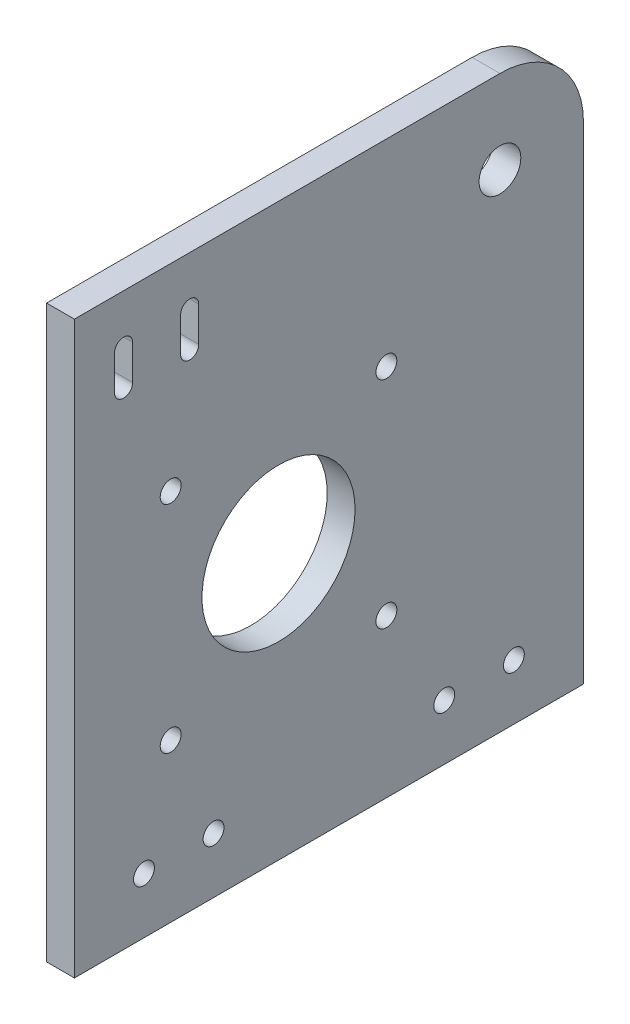
ISO-10303-21;
HEADER;
FILE_DESCRIPTION(('STEP AP214'),'2;1');
FILE_NAME('part.step','',(''),(''),'','','');
FILE_SCHEMA(('AUTOMOTIVE_DESIGN { 1 0 10303 214 1 1 1 1 }'));
ENDSEC;
DATA;
#1=APPLICATION_CONTEXT('core data for automotive mechanical design processes');
#2=APPLICATION_PROTOCOL_DEFINITION('international standard','automotive_design',2000,#1);
#3=PRODUCT_CONTEXT('',#1,'mechanical');
#4=PRODUCT('Part','Part','',(#3));
#5=PRODUCT_RELATED_PRODUCT_CATEGORY('part','',(#4));
#6=PRODUCT_DEFINITION_FORMATION('','',#4);
#7=PRODUCT_DEFINITION_CONTEXT('part definition',#1,'design');
#8=PRODUCT_DEFINITION('design','',#6,#7);
#9=PRODUCT_DEFINITION_SHAPE('','',#8);
#10=(LENGTH_UNIT() NAMED_UNIT(*) SI_UNIT(.MILLI.,.METRE.));
#11=(NAMED_UNIT(*) PLANE_ANGLE_UNIT() SI_UNIT($,.RADIAN.));
#12=(NAMED_UNIT(*) SI_UNIT($,.STERADIAN.) SOLID_ANGLE_UNIT());
#13=UNCERTAINTY_MEASURE_WITH_UNIT(LENGTH_MEASURE(1.E-05),#10,'distance_accuracy_value','');
#14=(GEOMETRIC_REPRESENTATION_CONTEXT(3) GLOBAL_UNCERTAINTY_ASSIGNED_CONTEXT((#13)) GLOBAL_UNIT_ASSIGNED_CONTEXT((#10,
#11,#12)) REPRESENTATION_CONTEXT('',''));
#15=CARTESIAN_POINT('',(0.,0.,0.));
#16=DIRECTION('',(0.,0.,1.));
#17=DIRECTION('',(1.,0.,0.));
#18=AXIS2_PLACEMENT_3D('',#15,#16,#17);
#19=CARTESIAN_POINT('',(4.,0.,0.));
#20=DIRECTION('',(-1.,0.,0.));
#21=DIRECTION('',(0.,0.,1.));
#22=AXIS2_PLACEMENT_3D('',#19,#20,#21);
#23=CYLINDRICAL_SURFACE('',#22,12.);
#24=CARTESIAN_POINT('',(0.,0.,0.));
#25=DIRECTION('',(1.,0.,0.));
#26=DIRECTION('',(0.,0.,-1.));
#27=AXIS2_PLACEMENT_3D('',#24,#25,#26);
#28=CIRCLE('',#27,12.);
#29=CARTESIAN_POINT('',(0.,12.,0.));
#30=VERTEX_POINT('',#29);
#31=CARTESIAN_POINT('',(0.,0.,-12.));
#32=VERTEX_POINT('',#31);
#33=EDGE_CURVE('E250',#30,#32,#28,.F.);
#34=ORIENTED_EDGE('',*,*,#33,.F.);
#35=DIRECTION('',(-1.,0.,0.));
#36=VECTOR('',#35,1.);
#37=CARTESIAN_POINT('',(4.,12.,0.));
#38=LINE('',#37,#36);
#39=CARTESIAN_POINT('',(4.,12.,0.));
#40=VERTEX_POINT('',#39);
#41=EDGE_CURVE('E277',#40,#30,#38,.T.);
#42=ORIENTED_EDGE('',*,*,#41,.F.);
#43=CARTESIAN_POINT('',(4.,0.,0.));
#44=DIRECTION('',(1.,0.,0.));
#45=DIRECTION('',(0.,0.,-1.));
#46=AXIS2_PLACEMENT_3D('',#43,#44,#45);
#47=CIRCLE('',#46,12.);
#48=CARTESIAN_POINT('',(4.,0.,-12.));
#49=VERTEX_POINT('',#48);
#50=EDGE_CURVE('E206',#40,#49,#47,.F.);
#51=ORIENTED_EDGE('',*,*,#50,.T.);
#52=DIRECTION('',(-1.,0.,0.));
#53=VECTOR('',#52,1.);
#54=CARTESIAN_POINT('',(4.,0.,-12.));
#55=LINE('',#54,#53);
#56=EDGE_CURVE('E226',#49,#32,#55,.T.);
#57=ORIENTED_EDGE('',*,*,#56,.T.);
#58=EDGE_LOOP('',(#34,#42,#51,#57));
#59=FACE_BOUND('',#58,.T.);
#60=ADVANCED_FACE('F37',(#59),#23,.T.);
#61=CARTESIAN_POINT('',(4.,12.,0.));
#62=DIRECTION('',(0.,1.,0.));
#63=DIRECTION('',(0.,0.,1.));
#64=AXIS2_PLACEMENT_3D('',#61,#62,#63);
#65=PLANE('',#64);
#66=DIRECTION('',(0.,0.,-1.));
#67=VECTOR('',#66,1.);
#68=CARTESIAN_POINT('',(0.,12.,0.));
#69=LINE('',#68,#67);
#70=CARTESIAN_POINT('',(0.,12.,61.1551336484807));
#71=VERTEX_POINT('',#70);
#72=EDGE_CURVE('E253',#71,#30,#69,.T.);
#73=ORIENTED_EDGE('',*,*,#72,.F.);
#74=DIRECTION('',(-1.,0.,0.));
#75=VECTOR('',#74,1.);
#76=CARTESIAN_POINT('',(4.,12.,61.1551336484807));
#77=LINE('',#76,#75);
#78=CARTESIAN_POINT('',(4.,12.,61.1551336484807));
#79=VERTEX_POINT('',#78);
#80=EDGE_CURVE('E275',#79,#71,#77,.T.);
#81=ORIENTED_EDGE('',*,*,#80,.F.);
#82=DIRECTION('',(0.,0.,-1.));
#83=VECTOR('',#82,1.);
#84=CARTESIAN_POINT('',(4.,12.,0.));
#85=LINE('',#84,#83);
#86=EDGE_CURVE('E209',#79,#40,#85,.T.);
#87=ORIENTED_EDGE('',*,*,#86,.T.);
#88=ORIENTED_EDGE('',*,*,#41,.T.);
#89=EDGE_LOOP('',(#73,#81,#87,#88));
#90=FACE_BOUND('',#89,.T.);
#91=ADVANCED_FACE('F314',(#90),#65,.T.);
#92=CARTESIAN_POINT('',(4.,0.,61.1551336484807));
#93=DIRECTION('',(0.,0.,1.));
#94=DIRECTION('',(1.,0.,0.));
#95=AXIS2_PLACEMENT_3D('',#92,#93,#94);
#96=PLANE('',#95);
#97=DIRECTION('',(0.,1.,0.));
#98=VECTOR('',#97,1.);
#99=CARTESIAN_POINT('',(0.,0.,61.1551336484807));
#100=LINE('',#99,#98);
#101=CARTESIAN_POINT('',(0.,-70.,61.1551336484807));
#102=VERTEX_POINT('',#101);
#103=EDGE_CURVE('E256',#102,#71,#100,.T.);
#104=ORIENTED_EDGE('',*,*,#103,.F.);
#105=DIRECTION('',(-1.,0.,0.));
#106=VECTOR('',#105,1.);
#107=CARTESIAN_POINT('',(4.,-70.,61.1551336484807));
#108=LINE('',#107,#106);
#109=CARTESIAN_POINT('',(4.,-70.,61.1551336484807));
#110=VERTEX_POINT('',#109);
#111=EDGE_CURVE('E273',#110,#102,#108,.T.);
#112=ORIENTED_EDGE('',*,*,#111,.F.);
#113=DIRECTION('',(0.,1.,0.));
#114=VECTOR('',#113,1.);
#115=CARTESIAN_POINT('',(4.,0.,61.1551336484807));
#116=LINE('',#115,#114);
#117=EDGE_CURVE('E212',#110,#79,#116,.T.);
#118=ORIENTED_EDGE('',*,*,#117,.T.);
#119=ORIENTED_EDGE('',*,*,#80,.T.);
#120=EDGE_LOOP('',(#104,#112,#118,#119));
#121=FACE_BOUND('',#120,.T.);
#122=ADVANCED_FACE('F320',(#121),#96,.T.);
#123=CARTESIAN_POINT('',(4.,-70.,0.));
#124=DIRECTION('',(0.,1.,0.));
#125=DIRECTION('',(0.,0.,1.));
#126=AXIS2_PLACEMENT_3D('',#123,#124,#125);
#127=PLANE('',#126);
#128=DIRECTION('',(0.,0.,-1.));
#129=VECTOR('',#128,1.);
#130=CARTESIAN_POINT('',(0.,-70.,0.));
#131=LINE('',#130,#129);
#132=CARTESIAN_POINT('',(0.,-70.,-12.));
#133=VERTEX_POINT('',#132);
#134=EDGE_CURVE('E259',#102,#133,#131,.T.);
#135=ORIENTED_EDGE('',*,*,#134,.T.);
#136=DIRECTION('',(-1.,0.,0.));
#137=VECTOR('',#136,1.);
#138=CARTESIAN_POINT('',(4.,-70.,-12.));
#139=LINE('',#138,#137);
#140=CARTESIAN_POINT('',(4.,-70.,-12.));
#141=VERTEX_POINT('',#140);
#142=EDGE_CURVE('E271',#141,#133,#139,.T.);
#143=ORIENTED_EDGE('',*,*,#142,.F.);
#144=DIRECTION('',(0.,0.,-1.));
#145=VECTOR('',#144,1.);
#146=CARTESIAN_POINT('',(4.,-70.,0.));
#147=LINE('',#146,#145);
#148=EDGE_CURVE('E215',#110,#141,#147,.T.);
#149=ORIENTED_EDGE('',*,*,#148,.F.);
#150=ORIENTED_EDGE('',*,*,#111,.T.);
#151=EDGE_LOOP('',(#135,#143,#149,#150));
#152=FACE_BOUND('',#151,.T.);
#153=ADVANCED_FACE('F396',(#152),#127,.F.);
#154=CARTESIAN_POINT('',(4.,-62.,51.1551336484807));
#155=DIRECTION('',(-1.,0.,0.));
#156=DIRECTION('',(0.,0.,1.));
#157=AXIS2_PLACEMENT_3D('',#154,#155,#156);
#158=CYLINDRICAL_SURFACE('',#157,1.5);
#159=CARTESIAN_POINT('',(4.,-62.,51.1551336484807));
#160=DIRECTION('',(1.,0.,0.));
#161=DIRECTION('',(0.,0.,-1.));
#162=AXIS2_PLACEMENT_3D('',#159,#160,#161);
#163=CIRCLE('',#162,1.5);
#164=CARTESIAN_POINT('',(4.,-62.,49.6551336484807));
#165=VERTEX_POINT('',#164);
#166=EDGE_CURVE('E220',#165,#165,#163,.T.);
#167=ORIENTED_EDGE('',*,*,#166,.T.);
#168=EDGE_LOOP('',(#167));
#169=FACE_BOUND('',#168,.T.);
#170=CARTESIAN_POINT('',(0.,-62.,51.1551336484807));
#171=DIRECTION('',(1.,0.,0.));
#172=DIRECTION('',(0.,0.,-1.));
#173=AXIS2_PLACEMENT_3D('',#170,#171,#172);
#174=CIRCLE('',#173,1.5);
#175=CARTESIAN_POINT('',(0.,-62.,49.6551336484807));
#176=VERTEX_POINT('',#175);
#177=EDGE_CURVE('E265',#176,#176,#174,.T.);
#178=ORIENTED_EDGE('',*,*,#177,.F.);
#179=EDGE_LOOP('',(#178));
#180=FACE_BOUND('',#179,.T.);
#181=ADVANCED_FACE('F393',(#169,#180),#158,.F.);
#182=CARTESIAN_POINT('',(4.,0.,-12.));
#183=DIRECTION('',(0.,0.,-1.));
#184=DIRECTION('',(0.,1.,0.));
#185=AXIS2_PLACEMENT_3D('',#182,#183,#184);
#186=PLANE('',#185);
#187=DIRECTION('',(0.,-1.,0.));
#188=VECTOR('',#187,1.);
#189=CARTESIAN_POINT('',(0.,0.,-12.));
#190=LINE('',#189,#188);
#191=EDGE_CURVE('E262',#32,#133,#190,.T.);
#192=ORIENTED_EDGE('',*,*,#191,.F.);
#193=ORIENTED_EDGE('',*,*,#56,.F.);
#194=DIRECTION('',(0.,-1.,0.));
#195=VECTOR('',#194,1.);
#196=CARTESIAN_POINT('',(4.,0.,-12.));
#197=LINE('',#196,#195);
#198=EDGE_CURVE('E217',#49,#141,#197,.T.);
#199=ORIENTED_EDGE('',*,*,#198,.T.);
#200=ORIENTED_EDGE('',*,*,#142,.T.);
#201=EDGE_LOOP('',(#192,#193,#199,#200));
#202=FACE_BOUND('',#201,.T.);
#203=ADVANCED_FACE('F330',(#202),#186,.T.);
#204=CARTESIAN_POINT('',(4.,-31.8198051533946,31.8198051533946));
#205=DIRECTION('',(-1.,0.,0.));
#206=DIRECTION('',(0.,0.,1.));
#207=AXIS2_PLACEMENT_3D('',#204,#205,#206);
#208=CYLINDRICAL_SURFACE('',#207,11.);
#209=CARTESIAN_POINT('',(4.,-31.8198051533946,31.8198051533946));
#210=DIRECTION('',(1.,0.,0.));
#211=DIRECTION('',(0.,0.,-1.));
#212=AXIS2_PLACEMENT_3D('',#209,#210,#211);
#213=CIRCLE('',#212,11.);
#214=CARTESIAN_POINT('',(4.,-31.8198051533946,20.8198051533946));
#215=VERTEX_POINT('',#214);
#216=EDGE_CURVE('E203',#215,#215,#213,.T.);
#217=ORIENTED_EDGE('',*,*,#216,.T.);
#218=EDGE_LOOP('',(#217));
#219=FACE_BOUND('',#218,.T.);
#220=CARTESIAN_POINT('',(0.,-31.8198051533946,31.8198051533946));
#221=DIRECTION('',(1.,0.,0.));
#222=DIRECTION('',(0.,0.,-1.));
#223=AXIS2_PLACEMENT_3D('',#220,#221,#222);
#224=CIRCLE('',#223,11.);
#225=CARTESIAN_POINT('',(0.,-31.8198051533946,20.8198051533946));
#226=VERTEX_POINT('',#225);
#227=EDGE_CURVE('E247',#226,#226,#224,.T.);
#228=ORIENTED_EDGE('',*,*,#227,.F.);
#229=EDGE_LOOP('',(#228));
#230=FACE_BOUND('',#229,.T.);
#231=ADVANCED_FACE('F326',(#219,#230),#208,.F.);
#232=CARTESIAN_POINT('',(4.,-62.,41.1551336484807));
#233=DIRECTION('',(-1.,0.,0.));
#234=DIRECTION('',(0.,0.,1.));
#235=AXIS2_PLACEMENT_3D('',#232,#233,#234);
#236=CYLINDRICAL_SURFACE('',#235,1.5);
#237=CARTESIAN_POINT('',(4.,-62.,41.1551336484807));
#238=DIRECTION('',(1.,0.,0.));
#239=DIRECTION('',(0.,0.,-1.));
#240=AXIS2_PLACEMENT_3D('',#237,#238,#239);
#241=CIRCLE('',#240,1.5);
#242=CARTESIAN_POINT('',(4.,-62.,39.6551336484807));
#243=VERTEX_POINT('',#242);
#244=EDGE_CURVE('E200',#243,#243,#241,.T.);
#245=ORIENTED_EDGE('',*,*,#244,.T.);
#246=EDGE_LOOP('',(#245));
#247=FACE_BOUND('',#246,.T.);
#248=CARTESIAN_POINT('',(0.,-62.,41.1551336484807));
#249=DIRECTION('',(1.,0.,0.));
#250=DIRECTION('',(0.,0.,-1.));
#251=AXIS2_PLACEMENT_3D('',#248,#249,#250);
#252=CIRCLE('',#251,1.5);
#253=CARTESIAN_POINT('',(0.,-62.,39.6551336484807));
#254=VERTEX_POINT('',#253);
#255=EDGE_CURVE('E244',#254,#254,#252,.T.);
#256=ORIENTED_EDGE('',*,*,#255,.F.);
#257=EDGE_LOOP('',(#256));
#258=FACE_BOUND('',#257,.T.);
#259=ADVANCED_FACE('F329',(#247,#258),#236,.F.);
#260=CARTESIAN_POINT('',(4.,-62.,7.99999999999999));
#261=DIRECTION('',(-1.,0.,0.));
#262=DIRECTION('',(0.,0.,1.));
#263=AXIS2_PLACEMENT_3D('',#260,#261,#262);
#264=CYLINDRICAL_SURFACE('',#263,1.5);
#265=CARTESIAN_POINT('',(4.,-62.,7.99999999999999));
#266=DIRECTION('',(1.,0.,0.));
#267=DIRECTION('',(0.,0.,-1.));
#268=AXIS2_PLACEMENT_3D('',#265,#266,#267);
#269=CIRCLE('',#268,1.5);
#270=CARTESIAN_POINT('',(4.,-62.,6.49999999999999));
#271=VERTEX_POINT('',#270);
#272=EDGE_CURVE('E197',#271,#271,#269,.T.);
#273=ORIENTED_EDGE('',*,*,#272,.T.);
#274=EDGE_LOOP('',(#273));
#275=FACE_BOUND('',#274,.T.);
#276=CARTESIAN_POINT('',(0.,-62.,7.99999999999999));
#277=DIRECTION('',(1.,0.,0.));
#278=DIRECTION('',(0.,0.,-1.));
#279=AXIS2_PLACEMENT_3D('',#276,#277,#278);
#280=CIRCLE('',#279,1.5);
#281=CARTESIAN_POINT('',(0.,-62.,6.49999999999999));
#282=VERTEX_POINT('',#281);
#283=EDGE_CURVE('E241',#282,#282,#280,.T.);
#284=ORIENTED_EDGE('',*,*,#283,.F.);
#285=EDGE_LOOP('',(#284));
#286=FACE_BOUND('',#285,.T.);
#287=ADVANCED_FACE('F334',(#275,#286),#264,.F.);
#288=CARTESIAN_POINT('',(4.,-62.,-2.00000000000001));
#289=DIRECTION('',(-1.,0.,0.));
#290=DIRECTION('',(0.,0.,1.));
#291=AXIS2_PLACEMENT_3D('',#288,#289,#290);
#292=CYLINDRICAL_SURFACE('',#291,1.5);
#293=CARTESIAN_POINT('',(4.,-62.,-2.00000000000001));
#294=DIRECTION('',(1.,0.,0.));
#295=DIRECTION('',(0.,0.,-1.));
#296=AXIS2_PLACEMENT_3D('',#293,#294,#295);
#297=CIRCLE('',#296,1.5);
#298=CARTESIAN_POINT('',(4.,-62.,-3.50000000000001));
#299=VERTEX_POINT('',#298);
#300=EDGE_CURVE('E194',#299,#299,#297,.T.);
#301=ORIENTED_EDGE('',*,*,#300,.T.);
#302=EDGE_LOOP('',(#301));
#303=FACE_BOUND('',#302,.T.);
#304=CARTESIAN_POINT('',(0.,-62.,-2.00000000000001));
#305=DIRECTION('',(1.,0.,0.));
#306=DIRECTION('',(0.,0.,-1.));
#307=AXIS2_PLACEMENT_3D('',#304,#305,#306);
#308=CIRCLE('',#307,1.5);
#309=CARTESIAN_POINT('',(0.,-62.,-3.50000000000001));
#310=VERTEX_POINT('',#309);
#311=EDGE_CURVE('E238',#310,#310,#308,.T.);
#312=ORIENTED_EDGE('',*,*,#311,.F.);
#313=EDGE_LOOP('',(#312));
#314=FACE_BOUND('',#313,.T.);
#315=ADVANCED_FACE('F338',(#303,#314),#292,.F.);
#316=CARTESIAN_POINT('',(4.,-16.3198051533946,16.3198051533946));
#317=DIRECTION('',(-1.,0.,0.));
#318=DIRECTION('',(0.,0.,1.));
#319=AXIS2_PLACEMENT_3D('',#316,#317,#318);
#320=CYLINDRICAL_SURFACE('',#319,1.5);
#321=CARTESIAN_POINT('',(4.,-16.3198051533946,16.3198051533946));
#322=DIRECTION('',(1.,0.,0.));
#323=DIRECTION('',(0.,0.,-1.));
#324=AXIS2_PLACEMENT_3D('',#321,#322,#323);
#325=CIRCLE('',#324,1.5);
#326=CARTESIAN_POINT('',(4.,-16.3198051533946,14.8198051533946));
#327=VERTEX_POINT('',#326);
#328=EDGE_CURVE('E191',#327,#327,#325,.T.);
#329=ORIENTED_EDGE('',*,*,#328,.T.);
#330=EDGE_LOOP('',(#329));
#331=FACE_BOUND('',#330,.T.);
#332=CARTESIAN_POINT('',(0.,-16.3198051533946,16.3198051533946));
#333=DIRECTION('',(1.,0.,0.));
#334=DIRECTION('',(0.,0.,-1.));
#335=AXIS2_PLACEMENT_3D('',#332,#333,#334);
#336=CIRCLE('',#335,1.5);
#337=CARTESIAN_POINT('',(0.,-16.3198051533946,14.8198051533946));
#338=VERTEX_POINT('',#337);
#339=EDGE_CURVE('E235',#338,#338,#336,.T.);
#340=ORIENTED_EDGE('',*,*,#339,.F.);
#341=EDGE_LOOP('',(#340));
#342=FACE_BOUND('',#341,.T.);
#343=ADVANCED_FACE('F342',(#331,#342),#320,.F.);
#344=CARTESIAN_POINT('',(4.,-47.3198051466054,16.3198051533938));
#345=DIRECTION('',(-1.,0.,0.));
#346=DIRECTION('',(0.,0.,1.));
#347=AXIS2_PLACEMENT_3D('',#344,#345,#346);
#348=CYLINDRICAL_SURFACE('',#347,1.5);
#349=CARTESIAN_POINT('',(4.,-47.3198051466054,16.3198051533938));
#350=DIRECTION('',(1.,0.,0.));
#351=DIRECTION('',(0.,0.,-1.));
#352=AXIS2_PLACEMENT_3D('',#349,#350,#351);
#353=CIRCLE('',#352,1.5);
#354=CARTESIAN_POINT('',(4.,-47.3198051466054,14.8198051533938));
#355=VERTEX_POINT('',#354);
#356=EDGE_CURVE('E188',#355,#355,#353,.T.);
#357=ORIENTED_EDGE('',*,*,#356,.T.);
#358=EDGE_LOOP('',(#357));
#359=FACE_BOUND('',#358,.T.);
#360=CARTESIAN_POINT('',(0.,-47.3198051466054,16.3198051533938));
#361=DIRECTION('',(1.,0.,0.));
#362=DIRECTION('',(0.,0.,-1.));
#363=AXIS2_PLACEMENT_3D('',#360,#361,#362);
#364=CIRCLE('',#363,1.5);
#365=CARTESIAN_POINT('',(0.,-47.3198051466054,14.8198051533938));
#366=VERTEX_POINT('',#365);
#367=EDGE_CURVE('E232',#366,#366,#364,.T.);
#368=ORIENTED_EDGE('',*,*,#367,.F.);
#369=EDGE_LOOP('',(#368));
#370=FACE_BOUND('',#369,.T.);
#371=ADVANCED_FACE('F346',(#359,#370),#348,.F.);
#372=CARTESIAN_POINT('',(4.,-47.3198051466061,47.3198051466046));
#373=DIRECTION('',(-1.,0.,0.));
#374=DIRECTION('',(0.,0.,1.));
#375=AXIS2_PLACEMENT_3D('',#372,#373,#374);
#376=CYLINDRICAL_SURFACE('',#375,1.5);
#377=CARTESIAN_POINT('',(4.,-47.3198051466061,47.3198051466046));
#378=DIRECTION('',(1.,0.,0.));
#379=DIRECTION('',(0.,0.,-1.));
#380=AXIS2_PLACEMENT_3D('',#377,#378,#379);
#381=CIRCLE('',#380,1.5);
#382=CARTESIAN_POINT('',(4.,-47.3198051466061,45.8198051466046));
#383=VERTEX_POINT('',#382);
#384=EDGE_CURVE('E184',#383,#383,#381,.T.);
#385=ORIENTED_EDGE('',*,*,#384,.T.);
#386=EDGE_LOOP('',(#385));
#387=FACE_BOUND('',#386,.T.);
#388=CARTESIAN_POINT('',(0.,-47.3198051466061,47.3198051466046));
#389=DIRECTION('',(1.,0.,0.));
#390=DIRECTION('',(0.,0.,-1.));
#391=AXIS2_PLACEMENT_3D('',#388,#389,#390);
#392=CIRCLE('',#391,1.5);
#393=CARTESIAN_POINT('',(0.,-47.3198051466061,45.8198051466046));
#394=VERTEX_POINT('',#393);
#395=EDGE_CURVE('E229',#394,#394,#392,.T.);
#396=ORIENTED_EDGE('',*,*,#395,.F.);
#397=EDGE_LOOP('',(#396));
#398=FACE_BOUND('',#397,.T.);
#399=ADVANCED_FACE('F349',(#387,#398),#376,.F.);
#400=CARTESIAN_POINT('',(4.,-16.3198051533953,47.3198051466052));
#401=DIRECTION('',(-1.,0.,0.));
#402=DIRECTION('',(0.,0.,1.));
#403=AXIS2_PLACEMENT_3D('',#400,#401,#402);
#404=CYLINDRICAL_SURFACE('',#403,1.5);
#405=CARTESIAN_POINT('',(4.,-16.3198051533953,47.3198051466052));
#406=DIRECTION('',(1.,0.,0.));
#407=DIRECTION('',(0.,0.,-1.));
#408=AXIS2_PLACEMENT_3D('',#405,#406,#407);
#409=CIRCLE('',#408,1.5);
#410=CARTESIAN_POINT('',(4.,-16.3198051533953,45.8198051466052));
#411=VERTEX_POINT('',#410);
#412=EDGE_CURVE('E181',#411,#411,#409,.T.);
#413=ORIENTED_EDGE('',*,*,#412,.T.);
#414=EDGE_LOOP('',(#413));
#415=FACE_BOUND('',#414,.T.);
#416=CARTESIAN_POINT('',(0.,-16.3198051533953,47.3198051466052));
#417=DIRECTION('',(1.,0.,0.));
#418=DIRECTION('',(0.,0.,-1.));
#419=AXIS2_PLACEMENT_3D('',#416,#417,#418);
#420=CIRCLE('',#419,1.5);
#421=CARTESIAN_POINT('',(0.,-16.3198051533953,45.8198051466052));
#422=VERTEX_POINT('',#421);
#423=EDGE_CURVE('E174',#422,#422,#420,.T.);
#424=ORIENTED_EDGE('',*,*,#423,.F.);
#425=EDGE_LOOP('',(#424));
#426=FACE_BOUND('',#425,.T.);
#427=ADVANCED_FACE('F39',(#415,#426),#404,.F.);
#428=CARTESIAN_POINT('',(4.,0.,0.));
#429=DIRECTION('',(-1.,0.,0.));
#430=DIRECTION('',(0.,0.,1.));
#431=AXIS2_PLACEMENT_3D('',#428,#429,#430);
#432=CYLINDRICAL_SURFACE('',#431,3.);
#433=CARTESIAN_POINT('',(4.,0.,0.));
#434=DIRECTION('',(1.,0.,0.));
#435=DIRECTION('',(0.,0.,-1.));
#436=AXIS2_PLACEMENT_3D('',#433,#434,#435);
#437=CIRCLE('',#436,3.);
#438=CARTESIAN_POINT('',(4.,0.,-3.));
#439=VERTEX_POINT('',#438);
#440=EDGE_CURVE('E223',#439,#439,#437,.T.);
#441=ORIENTED_EDGE('',*,*,#440,.T.);
#442=EDGE_LOOP('',(#441));
#443=FACE_BOUND('',#442,.T.);
#444=CARTESIAN_POINT('',(0.,0.,0.));
#445=DIRECTION('',(1.,0.,0.));
#446=DIRECTION('',(0.,0.,-1.));
#447=AXIS2_PLACEMENT_3D('',#444,#445,#446);
#448=CIRCLE('',#447,3.);
#449=CARTESIAN_POINT('',(0.,0.,-3.));
#450=VERTEX_POINT('',#449);
#451=EDGE_CURVE('E185',#450,#450,#448,.T.);
#452=ORIENTED_EDGE('',*,*,#451,.F.);
#453=EDGE_LOOP('',(#452));
#454=FACE_BOUND('',#453,.T.);
#455=ADVANCED_FACE('F356',(#443,#454),#432,.F.);
#456=CARTESIAN_POINT('',(4.,0.,0.));
#457=DIRECTION('',(1.,0.,0.));
#458=DIRECTION('',(0.,0.,-1.));
#459=AXIS2_PLACEMENT_3D('',#456,#457,#458);
#460=PLANE('',#459);
#461=DIRECTION('',(0.,-1.,0.));
#462=VECTOR('',#461,1.);
#463=CARTESIAN_POINT('',(4.,0.,45.8840658366152));
#464=LINE('',#463,#462);
#465=CARTESIAN_POINT('',(4.,4.92893218813453,45.8840658366152));
#466=VERTEX_POINT('',#465);
#467=CARTESIAN_POINT('',(4.,-0.0710678118654717,45.8840658366152));
#468=VERTEX_POINT('',#467);
#469=EDGE_CURVE('E52',#466,#468,#464,.T.);
#470=ORIENTED_EDGE('',*,*,#469,.F.);
#471=CARTESIAN_POINT('',(4.,4.92893218813453,44.5840658366152));
#472=DIRECTION('',(1.,0.,0.));
#473=DIRECTION('',(0.,0.,-1.));
#474=AXIS2_PLACEMENT_3D('',#471,#472,#473);
#475=CIRCLE('',#474,1.3);
#476=CARTESIAN_POINT('',(4.,4.92893218813453,43.2840658366152));
#477=VERTEX_POINT('',#476);
#478=EDGE_CURVE('E151',#466,#477,#475,.F.);
#479=ORIENTED_EDGE('',*,*,#478,.T.);
#480=DIRECTION('',(0.,1.,0.));
#481=VECTOR('',#480,1.);
#482=CARTESIAN_POINT('',(4.,0.,43.2840658366152));
#483=LINE('',#482,#481);
#484=CARTESIAN_POINT('',(4.,-0.0710678118654717,43.2840658366152));
#485=VERTEX_POINT('',#484);
#486=EDGE_CURVE('E135',#485,#477,#483,.T.);
#487=ORIENTED_EDGE('',*,*,#486,.F.);
#488=CARTESIAN_POINT('',(4.,-0.0710678118654717,44.5840658366152));
#489=DIRECTION('',(1.,0.,0.));
#490=DIRECTION('',(0.,0.,-1.));
#491=AXIS2_PLACEMENT_3D('',#488,#489,#490);
#492=CIRCLE('',#491,1.3);
#493=EDGE_CURVE('E144',#468,#485,#492,.T.);
#494=ORIENTED_EDGE('',*,*,#493,.F.);
#495=EDGE_LOOP('',(#470,#479,#487,#494));
#496=FACE_BOUND('',#495,.T.);
#497=DIRECTION('',(0.,-1.,0.));
#498=VECTOR('',#497,1.);
#499=CARTESIAN_POINT('',(4.,0.,55.3840658366152));
#500=LINE('',#499,#498);
#501=CARTESIAN_POINT('',(4.,4.92893218813453,55.3840658366152));
#502=VERTEX_POINT('',#501);
#503=CARTESIAN_POINT('',(4.,-0.0710678118654717,55.3840658366152));
#504=VERTEX_POINT('',#503);
#505=EDGE_CURVE('E158',#502,#504,#500,.T.);
#506=ORIENTED_EDGE('',*,*,#505,.F.);
#507=CARTESIAN_POINT('',(4.,4.92893218813453,54.0840658366152));
#508=DIRECTION('',(1.,0.,0.));
#509=DIRECTION('',(0.,0.,-1.));
#510=AXIS2_PLACEMENT_3D('',#507,#508,#509);
#511=CIRCLE('',#510,1.3);
#512=CARTESIAN_POINT('',(4.,4.92893218813453,52.7840658366152));
#513=VERTEX_POINT('',#512);
#514=EDGE_CURVE('E168',#502,#513,#511,.F.);
#515=ORIENTED_EDGE('',*,*,#514,.T.);
#516=DIRECTION('',(0.,1.,0.));
#517=VECTOR('',#516,1.);
#518=CARTESIAN_POINT('',(4.,0.,52.7840658366152));
#519=LINE('',#518,#517);
#520=CARTESIAN_POINT('',(4.,-0.0710678118654717,52.7840658366152));
#521=VERTEX_POINT('',#520);
#522=EDGE_CURVE('E165',#521,#513,#519,.T.);
#523=ORIENTED_EDGE('',*,*,#522,.F.);
#524=CARTESIAN_POINT('',(4.,-0.0710678118654717,54.0840658366152));
#525=DIRECTION('',(1.,0.,0.));
#526=DIRECTION('',(0.,0.,-1.));
#527=AXIS2_PLACEMENT_3D('',#524,#525,#526);
#528=CIRCLE('',#527,1.3);
#529=EDGE_CURVE('E162',#504,#521,#528,.T.);
#530=ORIENTED_EDGE('',*,*,#529,.F.);
#531=EDGE_LOOP('',(#506,#515,#523,#530));
#532=FACE_BOUND('',#531,.T.);
#533=ORIENTED_EDGE('',*,*,#412,.F.);
#534=EDGE_LOOP('',(#533));
#535=FACE_BOUND('',#534,.T.);
#536=ORIENTED_EDGE('',*,*,#384,.F.);
#537=EDGE_LOOP('',(#536));
#538=FACE_BOUND('',#537,.T.);
#539=ORIENTED_EDGE('',*,*,#356,.F.);
#540=EDGE_LOOP('',(#539));
#541=FACE_BOUND('',#540,.T.);
#542=ORIENTED_EDGE('',*,*,#328,.F.);
#543=EDGE_LOOP('',(#542));
#544=FACE_BOUND('',#543,.T.);
#545=ORIENTED_EDGE('',*,*,#300,.F.);
#546=EDGE_LOOP('',(#545));
#547=FACE_BOUND('',#546,.T.);
#548=ORIENTED_EDGE('',*,*,#272,.F.);
#549=EDGE_LOOP('',(#548));
#550=FACE_BOUND('',#549,.T.);
#551=ORIENTED_EDGE('',*,*,#244,.F.);
#552=EDGE_LOOP('',(#551));
#553=FACE_BOUND('',#552,.T.);
#554=ORIENTED_EDGE('',*,*,#216,.F.);
#555=EDGE_LOOP('',(#554));
#556=FACE_BOUND('',#555,.T.);
#557=ORIENTED_EDGE('',*,*,#50,.F.);
#558=ORIENTED_EDGE('',*,*,#86,.F.);
#559=ORIENTED_EDGE('',*,*,#117,.F.);
#560=ORIENTED_EDGE('',*,*,#148,.T.);
#561=ORIENTED_EDGE('',*,*,#198,.F.);
#562=EDGE_LOOP('',(#557,#558,#559,#560,#561));
#563=FACE_BOUND('',#562,.T.);
#564=ORIENTED_EDGE('',*,*,#166,.F.);
#565=EDGE_LOOP('',(#564));
#566=FACE_BOUND('',#565,.T.);
#567=ORIENTED_EDGE('',*,*,#440,.F.);
#568=EDGE_LOOP('',(#567));
#569=FACE_BOUND('',#568,.T.);
#570=ADVANCED_FACE('F148',(#496,#532,#535,#538,#541,#544,#547,#550,#553,#556,#563,#566,#569),
#460,.T.);
#571=CARTESIAN_POINT('',(0.,0.,0.));
#572=DIRECTION('',(1.,0.,0.));
#573=DIRECTION('',(0.,0.,-1.));
#574=AXIS2_PLACEMENT_3D('',#571,#572,#573);
#575=PLANE('',#574);
#576=CARTESIAN_POINT('',(0.,4.92893218813453,44.5840658366152));
#577=DIRECTION('',(1.,0.,0.));
#578=DIRECTION('',(0.,0.,-1.));
#579=AXIS2_PLACEMENT_3D('',#576,#577,#578);
#580=CIRCLE('',#579,1.3);
#581=CARTESIAN_POINT('',(0.,4.92893218813453,45.8840658366152));
#582=VERTEX_POINT('',#581);
#583=CARTESIAN_POINT('',(0.,4.92893218813453,43.2840658366152));
#584=VERTEX_POINT('',#583);
#585=EDGE_CURVE('E45',#582,#584,#580,.F.);
#586=ORIENTED_EDGE('',*,*,#585,.F.);
#587=DIRECTION('',(0.,-1.,0.));
#588=VECTOR('',#587,1.);
#589=CARTESIAN_POINT('',(0.,0.,45.8840658366152));
#590=LINE('',#589,#588);
#591=CARTESIAN_POINT('',(0.,-0.0710678118654717,45.8840658366152));
#592=VERTEX_POINT('',#591);
#593=EDGE_CURVE('E11',#582,#592,#590,.T.);
#594=ORIENTED_EDGE('',*,*,#593,.T.);
#595=CARTESIAN_POINT('',(0.,-0.0710678118654717,44.5840658366152));
#596=DIRECTION('',(1.,0.,0.));
#597=DIRECTION('',(0.,0.,-1.));
#598=AXIS2_PLACEMENT_3D('',#595,#596,#597);
#599=CIRCLE('',#598,1.3);
#600=CARTESIAN_POINT('',(0.,-0.0710678118654717,43.2840658366152));
#601=VERTEX_POINT('',#600);
#602=EDGE_CURVE('E290',#592,#601,#599,.T.);
#603=ORIENTED_EDGE('',*,*,#602,.T.);
#604=DIRECTION('',(0.,1.,0.));
#605=VECTOR('',#604,1.);
#606=CARTESIAN_POINT('',(0.,0.,43.2840658366152));
#607=LINE('',#606,#605);
#608=EDGE_CURVE('E138',#601,#584,#607,.T.);
#609=ORIENTED_EDGE('',*,*,#608,.T.);
#610=EDGE_LOOP('',(#586,#594,#603,#609));
#611=FACE_BOUND('',#610,.T.);
#612=CARTESIAN_POINT('',(0.,4.92893218813453,54.0840658366152));
#613=DIRECTION('',(1.,0.,0.));
#614=DIRECTION('',(0.,0.,-1.));
#615=AXIS2_PLACEMENT_3D('',#612,#613,#614);
#616=CIRCLE('',#615,1.3);
#617=CARTESIAN_POINT('',(0.,4.92893218813453,55.3840658366152));
#618=VERTEX_POINT('',#617);
#619=CARTESIAN_POINT('',(0.,4.92893218813453,52.7840658366152));
#620=VERTEX_POINT('',#619);
#621=EDGE_CURVE('E285',#618,#620,#616,.F.);
#622=ORIENTED_EDGE('',*,*,#621,.F.);
#623=DIRECTION('',(0.,-1.,0.));
#624=VECTOR('',#623,1.);
#625=CARTESIAN_POINT('',(0.,0.,55.3840658366152));
#626=LINE('',#625,#624);
#627=CARTESIAN_POINT('',(0.,-0.0710678118654717,55.3840658366152));
#628=VERTEX_POINT('',#627);
#629=EDGE_CURVE('E287',#618,#628,#626,.T.);
#630=ORIENTED_EDGE('',*,*,#629,.T.);
#631=CARTESIAN_POINT('',(0.,-0.0710678118654717,54.0840658366152));
#632=DIRECTION('',(1.,0.,0.));
#633=DIRECTION('',(0.,0.,-1.));
#634=AXIS2_PLACEMENT_3D('',#631,#632,#633);
#635=CIRCLE('',#634,1.3);
#636=CARTESIAN_POINT('',(0.,-0.0710678118654717,52.7840658366152));
#637=VERTEX_POINT('',#636);
#638=EDGE_CURVE('E279',#628,#637,#635,.T.);
#639=ORIENTED_EDGE('',*,*,#638,.T.);
#640=DIRECTION('',(0.,1.,0.));
#641=VECTOR('',#640,1.);
#642=CARTESIAN_POINT('',(0.,0.,52.7840658366152));
#643=LINE('',#642,#641);
#644=EDGE_CURVE('E282',#637,#620,#643,.T.);
#645=ORIENTED_EDGE('',*,*,#644,.T.);
#646=EDGE_LOOP('',(#622,#630,#639,#645));
#647=FACE_BOUND('',#646,.T.);
#648=ORIENTED_EDGE('',*,*,#423,.T.);
#649=EDGE_LOOP('',(#648));
#650=FACE_BOUND('',#649,.T.);
#651=ORIENTED_EDGE('',*,*,#395,.T.);
#652=EDGE_LOOP('',(#651));
#653=FACE_BOUND('',#652,.T.);
#654=ORIENTED_EDGE('',*,*,#367,.T.);
#655=EDGE_LOOP('',(#654));
#656=FACE_BOUND('',#655,.T.);
#657=ORIENTED_EDGE('',*,*,#339,.T.);
#658=EDGE_LOOP('',(#657));
#659=FACE_BOUND('',#658,.T.);
#660=ORIENTED_EDGE('',*,*,#311,.T.);
#661=EDGE_LOOP('',(#660));
#662=FACE_BOUND('',#661,.T.);
#663=ORIENTED_EDGE('',*,*,#283,.T.);
#664=EDGE_LOOP('',(#663));
#665=FACE_BOUND('',#664,.T.);
#666=ORIENTED_EDGE('',*,*,#255,.T.);
#667=EDGE_LOOP('',(#666));
#668=FACE_BOUND('',#667,.T.);
#669=ORIENTED_EDGE('',*,*,#227,.T.);
#670=EDGE_LOOP('',(#669));
#671=FACE_BOUND('',#670,.T.);
#672=ORIENTED_EDGE('',*,*,#33,.T.);
#673=ORIENTED_EDGE('',*,*,#191,.T.);
#674=ORIENTED_EDGE('',*,*,#134,.F.);
#675=ORIENTED_EDGE('',*,*,#103,.T.);
#676=ORIENTED_EDGE('',*,*,#72,.T.);
#677=EDGE_LOOP('',(#672,#673,#674,#675,#676));
#678=FACE_BOUND('',#677,.T.);
#679=ORIENTED_EDGE('',*,*,#177,.T.);
#680=EDGE_LOOP('',(#679));
#681=FACE_BOUND('',#680,.T.);
#682=ORIENTED_EDGE('',*,*,#451,.T.);
#683=EDGE_LOOP('',(#682));
#684=FACE_BOUND('',#683,.T.);
#685=ADVANCED_FACE('F297',(#611,#647,#650,#653,#656,#659,#662,#665,#668,#671,#678,#681,#684),
#575,.F.);
#686=CARTESIAN_POINT('',(-6.,0.,55.3840658366152));
#687=DIRECTION('',(0.,0.,1.));
#688=DIRECTION('',(1.,0.,0.));
#689=AXIS2_PLACEMENT_3D('',#686,#687,#688);
#690=PLANE('',#689);
#691=DIRECTION('',(1.,0.,0.));
#692=VECTOR('',#691,1.);
#693=CARTESIAN_POINT('',(-6.,4.92893218813453,55.3840658366152));
#694=LINE('',#693,#692);
#695=EDGE_CURVE('E172',#618,#502,#694,.T.);
#696=ORIENTED_EDGE('',*,*,#695,.T.);
#697=ORIENTED_EDGE('',*,*,#505,.T.);
#698=DIRECTION('',(1.,0.,0.));
#699=VECTOR('',#698,1.);
#700=CARTESIAN_POINT('',(-6.,-0.0710678118654717,55.3840658366152));
#701=LINE('',#700,#699);
#702=EDGE_CURVE('E171',#628,#504,#701,.T.);
#703=ORIENTED_EDGE('',*,*,#702,.F.);
#704=ORIENTED_EDGE('',*,*,#629,.F.);
#705=EDGE_LOOP('',(#696,#697,#703,#704));
#706=FACE_BOUND('',#705,.T.);
#707=ADVANCED_FACE('F364',(#706),#690,.F.);
#708=CARTESIAN_POINT('',(-6.,4.92893218813453,54.0840658366152));
#709=DIRECTION('',(1.,0.,0.));
#710=DIRECTION('',(0.,0.,-1.));
#711=AXIS2_PLACEMENT_3D('',#708,#709,#710);
#712=CYLINDRICAL_SURFACE('',#711,1.3);
#713=ORIENTED_EDGE('',*,*,#621,.T.);
#714=DIRECTION('',(1.,0.,0.));
#715=VECTOR('',#714,1.);
#716=CARTESIAN_POINT('',(-6.,4.92893218813453,52.7840658366152));
#717=LINE('',#716,#715);
#718=EDGE_CURVE('E175',#620,#513,#717,.T.);
#719=ORIENTED_EDGE('',*,*,#718,.T.);
#720=ORIENTED_EDGE('',*,*,#514,.F.);
#721=ORIENTED_EDGE('',*,*,#695,.F.);
#722=EDGE_LOOP('',(#713,#719,#720,#721));
#723=FACE_BOUND('',#722,.T.);
#724=ADVANCED_FACE('F490',(#723),#712,.F.);
#725=CARTESIAN_POINT('',(-6.,0.,52.7840658366152));
#726=DIRECTION('',(0.,0.,-1.));
#727=DIRECTION('',(-1.,0.,0.));
#728=AXIS2_PLACEMENT_3D('',#725,#726,#727);
#729=PLANE('',#728);
#730=DIRECTION('',(1.,0.,0.));
#731=VECTOR('',#730,1.);
#732=CARTESIAN_POINT('',(-6.,-0.0710678118654717,52.7840658366152));
#733=LINE('',#732,#731);
#734=EDGE_CURVE('E177',#637,#521,#733,.T.);
#735=ORIENTED_EDGE('',*,*,#734,.T.);
#736=ORIENTED_EDGE('',*,*,#522,.T.);
#737=ORIENTED_EDGE('',*,*,#718,.F.);
#738=ORIENTED_EDGE('',*,*,#644,.F.);
#739=EDGE_LOOP('',(#735,#736,#737,#738));
#740=FACE_BOUND('',#739,.T.);
#741=ADVANCED_FACE('F308',(#740),#729,.F.);
#742=CARTESIAN_POINT('',(-6.,-0.0710678118654717,54.0840658366152));
#743=DIRECTION('',(1.,0.,0.));
#744=DIRECTION('',(0.,0.,-1.));
#745=AXIS2_PLACEMENT_3D('',#742,#743,#744);
#746=CYLINDRICAL_SURFACE('',#745,1.3);
#747=ORIENTED_EDGE('',*,*,#702,.T.);
#748=ORIENTED_EDGE('',*,*,#529,.T.);
#749=ORIENTED_EDGE('',*,*,#734,.F.);
#750=ORIENTED_EDGE('',*,*,#638,.F.);
#751=EDGE_LOOP('',(#747,#748,#749,#750));
#752=FACE_BOUND('',#751,.T.);
#753=ADVANCED_FACE('F301',(#752),#746,.F.);
#754=CARTESIAN_POINT('',(-6.,0.,45.8840658366152));
#755=DIRECTION('',(0.,0.,1.));
#756=DIRECTION('',(1.,0.,0.));
#757=AXIS2_PLACEMENT_3D('',#754,#755,#756);
#758=PLANE('',#757);
#759=DIRECTION('',(1.,0.,0.));
#760=VECTOR('',#759,1.);
#761=CARTESIAN_POINT('',(-6.,4.92893218813453,45.8840658366152));
#762=LINE('',#761,#760);
#763=EDGE_CURVE('E156',#582,#466,#762,.T.);
#764=ORIENTED_EDGE('',*,*,#763,.T.);
#765=ORIENTED_EDGE('',*,*,#469,.T.);
#766=DIRECTION('',(1.,0.,0.));
#767=VECTOR('',#766,1.);
#768=CARTESIAN_POINT('',(-6.,-0.0710678118654717,45.8840658366152));
#769=LINE('',#768,#767);
#770=EDGE_CURVE('E141',#592,#468,#769,.T.);
#771=ORIENTED_EDGE('',*,*,#770,.F.);
#772=ORIENTED_EDGE('',*,*,#593,.F.);
#773=EDGE_LOOP('',(#764,#765,#771,#772));
#774=FACE_BOUND('',#773,.T.);
#775=ADVANCED_FACE('F299',(#774),#758,.F.);
#776=CARTESIAN_POINT('',(-6.,4.92893218813453,44.5840658366152));
#777=DIRECTION('',(1.,0.,0.));
#778=DIRECTION('',(0.,0.,-1.));
#779=AXIS2_PLACEMENT_3D('',#776,#777,#778);
#780=CYLINDRICAL_SURFACE('',#779,1.3);
#781=ORIENTED_EDGE('',*,*,#585,.T.);
#782=DIRECTION('',(1.,0.,0.));
#783=VECTOR('',#782,1.);
#784=CARTESIAN_POINT('',(-6.,4.92893218813453,43.2840658366152));
#785=LINE('',#784,#783);
#786=EDGE_CURVE('E140',#584,#477,#785,.T.);
#787=ORIENTED_EDGE('',*,*,#786,.T.);
#788=ORIENTED_EDGE('',*,*,#478,.F.);
#789=ORIENTED_EDGE('',*,*,#763,.F.);
#790=EDGE_LOOP('',(#781,#787,#788,#789));
#791=FACE_BOUND('',#790,.T.);
#792=ADVANCED_FACE('F295',(#791),#780,.F.);
#793=CARTESIAN_POINT('',(-6.,0.,43.2840658366152));
#794=DIRECTION('',(0.,0.,-1.));
#795=DIRECTION('',(-1.,0.,0.));
#796=AXIS2_PLACEMENT_3D('',#793,#794,#795);
#797=PLANE('',#796);
#798=DIRECTION('',(1.,0.,0.));
#799=VECTOR('',#798,1.);
#800=CARTESIAN_POINT('',(-6.,-0.0710678118654717,43.2840658366152));
#801=LINE('',#800,#799);
#802=EDGE_CURVE('E60',#601,#485,#801,.T.);
#803=ORIENTED_EDGE('',*,*,#802,.T.);
#804=ORIENTED_EDGE('',*,*,#486,.T.);
#805=ORIENTED_EDGE('',*,*,#786,.F.);
#806=ORIENTED_EDGE('',*,*,#608,.F.);
#807=EDGE_LOOP('',(#803,#804,#805,#806));
#808=FACE_BOUND('',#807,.T.);
#809=ADVANCED_FACE('F132',(#808),#797,.F.);
#810=CARTESIAN_POINT('',(-6.,-0.0710678118654717,44.5840658366152));
#811=DIRECTION('',(1.,0.,0.));
#812=DIRECTION('',(0.,0.,-1.));
#813=AXIS2_PLACEMENT_3D('',#810,#811,#812);
#814=CYLINDRICAL_SURFACE('',#813,1.3);
#815=ORIENTED_EDGE('',*,*,#770,.T.);
#816=ORIENTED_EDGE('',*,*,#493,.T.);
#817=ORIENTED_EDGE('',*,*,#802,.F.);
#818=ORIENTED_EDGE('',*,*,#602,.F.);
#819=EDGE_LOOP('',(#815,#816,#817,#818));
#820=FACE_BOUND('',#819,.T.);
#821=ADVANCED_FACE('F145',(#820),#814,.F.);
#822=CLOSED_SHELL('',(#60,#91,#122,#153,#181,#203,#231,#259,#287,#315,#343,#371,#399,#427,#455,
#570,#685,#707,#724,#741,#753,#775,#792,#809,#821));
#823=MANIFOLD_SOLID_BREP('B2',#822);
#824=ADVANCED_BREP_SHAPE_REPRESENTATION('',(#18,#823),#14);
#825=SHAPE_DEFINITION_REPRESENTATION(#9,#824);
ENDSEC;
END-ISO-10303-21;
